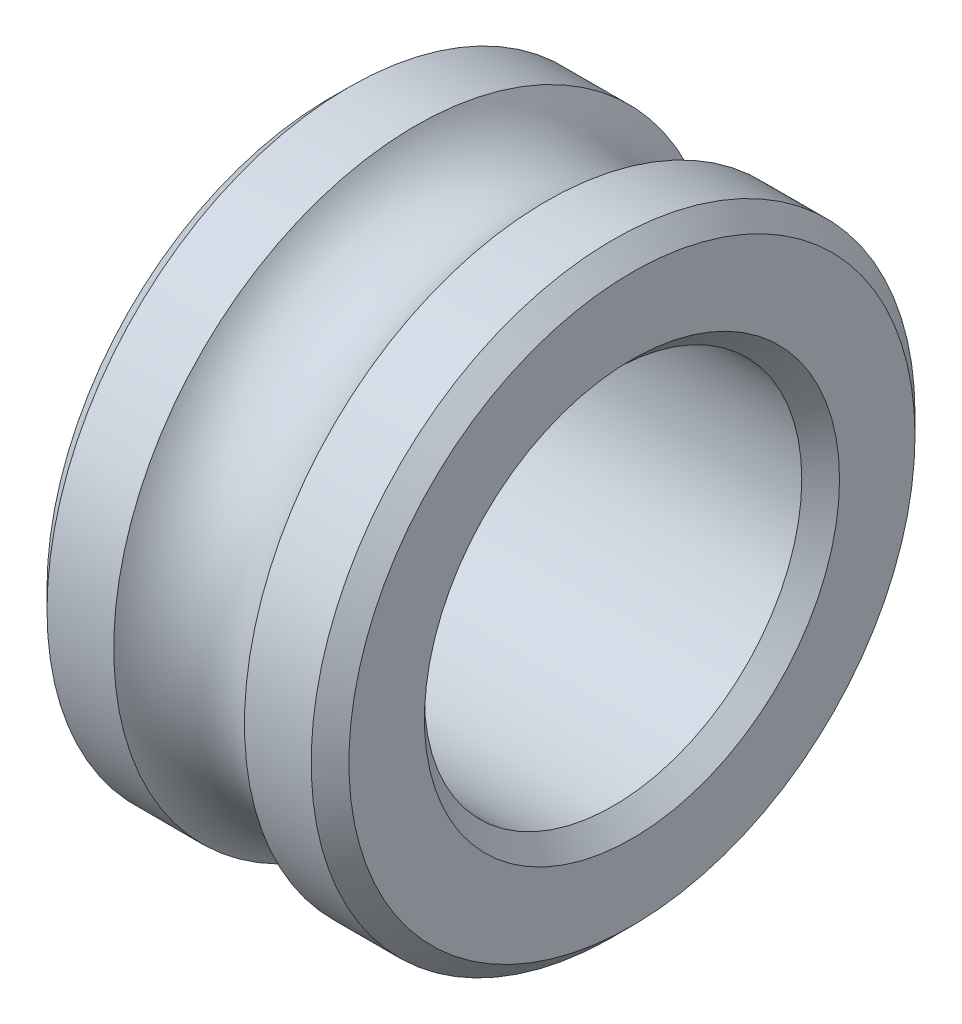
ISO-10303-21;
HEADER;
FILE_DESCRIPTION(('STEP AP214'),'2;1');
FILE_NAME('part.step','',(''),(''),'','','');
FILE_SCHEMA(('AUTOMOTIVE_DESIGN { 1 0 10303 214 1 1 1 1 }'));
ENDSEC;
DATA;
#1=APPLICATION_CONTEXT('core data for automotive mechanical design processes');
#2=APPLICATION_PROTOCOL_DEFINITION('international standard','automotive_design',2000,#1);
#3=PRODUCT_CONTEXT('',#1,'mechanical');
#4=PRODUCT('Part','Part','',(#3));
#5=PRODUCT_RELATED_PRODUCT_CATEGORY('part','',(#4));
#6=PRODUCT_DEFINITION_FORMATION('','',#4);
#7=PRODUCT_DEFINITION_CONTEXT('part definition',#1,'design');
#8=PRODUCT_DEFINITION('design','',#6,#7);
#9=PRODUCT_DEFINITION_SHAPE('','',#8);
#10=(LENGTH_UNIT() NAMED_UNIT(*) SI_UNIT(.MILLI.,.METRE.));
#11=(NAMED_UNIT(*) PLANE_ANGLE_UNIT() SI_UNIT($,.RADIAN.));
#12=(NAMED_UNIT(*) SI_UNIT($,.STERADIAN.) SOLID_ANGLE_UNIT());
#13=UNCERTAINTY_MEASURE_WITH_UNIT(LENGTH_MEASURE(1.E-05),#10,'distance_accuracy_value','');
#14=(GEOMETRIC_REPRESENTATION_CONTEXT(3) GLOBAL_UNCERTAINTY_ASSIGNED_CONTEXT((#13)) GLOBAL_UNIT_ASSIGNED_CONTEXT((#10,
#11,#12)) REPRESENTATION_CONTEXT('',''));
#15=CARTESIAN_POINT('',(0.,0.,0.));
#16=DIRECTION('',(0.,0.,1.));
#17=DIRECTION('',(1.,0.,0.));
#18=AXIS2_PLACEMENT_3D('',#15,#16,#17);
#19=CARTESIAN_POINT('',(-0.523961525529598,8.,0.));
#20=DIRECTION('',(1.,0.,0.));
#21=DIRECTION('',(0.,0.,-1.));
#22=AXIS2_PLACEMENT_3D('',#19,#20,#21);
#23=PLANE('',#22);
#24=CARTESIAN_POINT('',(-0.523961525529598,0.,0.));
#25=DIRECTION('',(1.,0.,0.));
#26=DIRECTION('',(0.,0.,-1.));
#27=AXIS2_PLACEMENT_3D('',#24,#25,#26);
#28=CIRCLE('',#27,7.5);
#29=CARTESIAN_POINT('',(-0.523961525529598,0.,-7.5));
#30=VERTEX_POINT('',#29);
#31=EDGE_CURVE('E58',#30,#30,#28,.T.);
#32=ORIENTED_EDGE('',*,*,#31,.T.);
#33=EDGE_LOOP('',(#32));
#34=FACE_BOUND('',#33,.T.);
#35=CARTESIAN_POINT('',(-0.523961525529598,0.,0.));
#36=DIRECTION('',(1.,0.,0.));
#37=DIRECTION('',(0.,0.,-1.));
#38=AXIS2_PLACEMENT_3D('',#35,#36,#37);
#39=CIRCLE('',#38,5.50000000000001);
#40=CARTESIAN_POINT('',(-0.523961525529598,0.,-5.50000000000001));
#41=VERTEX_POINT('',#40);
#42=EDGE_CURVE('E64',#41,#41,#39,.F.);
#43=ORIENTED_EDGE('',*,*,#42,.T.);
#44=EDGE_LOOP('',(#43));
#45=FACE_BOUND('',#44,.T.);
#46=ADVANCED_FACE('F39',(#34,#45),#23,.T.);
#47=CARTESIAN_POINT('',(0.,0.,0.));
#48=DIRECTION('',(1.,0.,0.));
#49=DIRECTION('',(0.,0.,-1.));
#50=AXIS2_PLACEMENT_3D('',#47,#48,#49);
#51=CYLINDRICAL_SURFACE('',#50,8.);
#52=CARTESIAN_POINT('',(-1.02396152552961,0.,0.));
#53=DIRECTION('',(1.,0.,0.));
#54=DIRECTION('',(0.,0.,-1.));
#55=AXIS2_PLACEMENT_3D('',#52,#53,#54);
#56=CIRCLE('',#55,8.);
#57=CARTESIAN_POINT('',(-1.02396152552961,0.,-8.));
#58=VERTEX_POINT('',#57);
#59=EDGE_CURVE('E53',#58,#58,#56,.F.);
#60=ORIENTED_EDGE('',*,*,#59,.T.);
#61=EDGE_LOOP('',(#60));
#62=FACE_BOUND('',#61,.T.);
#63=CARTESIAN_POINT('',(-2.79191071796072,0.,0.));
#64=DIRECTION('',(1.,0.,0.));
#65=DIRECTION('',(0.,0.,-1.));
#66=AXIS2_PLACEMENT_3D('',#63,#64,#65);
#67=CIRCLE('',#66,8.);
#68=CARTESIAN_POINT('',(-2.79191071796072,0.,-8.));
#69=VERTEX_POINT('',#68);
#70=EDGE_CURVE('E80',#69,#69,#67,.T.);
#71=ORIENTED_EDGE('',*,*,#70,.T.);
#72=EDGE_LOOP('',(#71));
#73=FACE_BOUND('',#72,.T.);
#74=ADVANCED_FACE('F104',(#62,#73),#51,.T.);
#75=CARTESIAN_POINT('',(-4.5239615255296,0.,0.));
#76=DIRECTION('',(1.,0.,0.));
#77=DIRECTION('',(0.,0.,-1.));
#78=AXIS2_PLACEMENT_3D('',#75,#76,#77);
#79=TOROIDAL_SURFACE('',#78,9.,2.);
#80=CARTESIAN_POINT('',(-6.25601233309848,0.,0.));
#81=DIRECTION('',(1.,0.,0.));
#82=DIRECTION('',(0.,0.,-1.));
#83=AXIS2_PLACEMENT_3D('',#80,#81,#82);
#84=CIRCLE('',#83,8.);
#85=CARTESIAN_POINT('',(-6.25601233309848,0.,-8.));
#86=VERTEX_POINT('',#85);
#87=EDGE_CURVE('E84',#86,#86,#84,.T.);
#88=ORIENTED_EDGE('',*,*,#87,.T.);
#89=EDGE_LOOP('',(#88));
#90=FACE_BOUND('',#89,.T.);
#91=ORIENTED_EDGE('',*,*,#70,.F.);
#92=EDGE_LOOP('',(#91));
#93=FACE_BOUND('',#92,.T.);
#94=ADVANCED_FACE('F89',(#90,#93),#79,.F.);
#95=CARTESIAN_POINT('',(0.,0.,0.));
#96=DIRECTION('',(1.,0.,0.));
#97=DIRECTION('',(0.,0.,-1.));
#98=AXIS2_PLACEMENT_3D('',#95,#96,#97);
#99=CYLINDRICAL_SURFACE('',#98,8.);
#100=CARTESIAN_POINT('',(-8.02396152552959,0.,0.));
#101=DIRECTION('',(-1.,0.,0.));
#102=DIRECTION('',(0.,0.,1.));
#103=AXIS2_PLACEMENT_3D('',#100,#101,#102);
#104=CIRCLE('',#103,8.);
#105=CARTESIAN_POINT('',(-8.02396152552959,0.,8.));
#106=VERTEX_POINT('',#105);
#107=EDGE_CURVE('E76',#106,#106,#104,.F.);
#108=ORIENTED_EDGE('',*,*,#107,.T.);
#109=EDGE_LOOP('',(#108));
#110=FACE_BOUND('',#109,.T.);
#111=ORIENTED_EDGE('',*,*,#87,.F.);
#112=EDGE_LOOP('',(#111));
#113=FACE_BOUND('',#112,.T.);
#114=ADVANCED_FACE('F92',(#110,#113),#99,.T.);
#115=CARTESIAN_POINT('',(-8.5239615255296,5.,0.));
#116=DIRECTION('',(-1.,0.,0.));
#117=DIRECTION('',(0.,0.,1.));
#118=AXIS2_PLACEMENT_3D('',#115,#116,#117);
#119=PLANE('',#118);
#120=CARTESIAN_POINT('',(-8.5239615255296,0.,0.));
#121=DIRECTION('',(-1.,0.,0.));
#122=DIRECTION('',(0.,0.,1.));
#123=AXIS2_PLACEMENT_3D('',#120,#121,#122);
#124=CIRCLE('',#123,7.49999999999999);
#125=CARTESIAN_POINT('',(-8.5239615255296,0.,7.49999999999999));
#126=VERTEX_POINT('',#125);
#127=EDGE_CURVE('E68',#126,#126,#124,.T.);
#128=ORIENTED_EDGE('',*,*,#127,.T.);
#129=EDGE_LOOP('',(#128));
#130=FACE_BOUND('',#129,.T.);
#131=CARTESIAN_POINT('',(-8.5239615255296,0.,0.));
#132=DIRECTION('',(-1.,0.,0.));
#133=DIRECTION('',(0.,0.,1.));
#134=AXIS2_PLACEMENT_3D('',#131,#132,#133);
#135=CIRCLE('',#134,5.5);
#136=CARTESIAN_POINT('',(-8.5239615255296,0.,5.5));
#137=VERTEX_POINT('',#136);
#138=EDGE_CURVE('E72',#137,#137,#135,.F.);
#139=ORIENTED_EDGE('',*,*,#138,.T.);
#140=EDGE_LOOP('',(#139));
#141=FACE_BOUND('',#140,.T.);
#142=ADVANCED_FACE('F94',(#130,#141),#119,.T.);
#143=CARTESIAN_POINT('',(0.,0.,0.));
#144=DIRECTION('',(1.,0.,0.));
#145=DIRECTION('',(0.,0.,-1.));
#146=AXIS2_PLACEMENT_3D('',#143,#144,#145);
#147=CYLINDRICAL_SURFACE('',#146,5.);
#148=CARTESIAN_POINT('',(-8.02396152552959,0.,0.));
#149=DIRECTION('',(-1.,0.,0.));
#150=DIRECTION('',(0.,0.,1.));
#151=AXIS2_PLACEMENT_3D('',#148,#149,#150);
#152=CIRCLE('',#151,5.);
#153=CARTESIAN_POINT('',(-8.02396152552959,0.,5.));
#154=VERTEX_POINT('',#153);
#155=EDGE_CURVE('E10',#154,#154,#152,.T.);
#156=ORIENTED_EDGE('',*,*,#155,.T.);
#157=EDGE_LOOP('',(#156));
#158=FACE_BOUND('',#157,.T.);
#159=CARTESIAN_POINT('',(-1.0239615255296,0.,0.));
#160=DIRECTION('',(1.,0.,0.));
#161=DIRECTION('',(0.,0.,-1.));
#162=AXIS2_PLACEMENT_3D('',#159,#160,#161);
#163=CIRCLE('',#162,5.);
#164=CARTESIAN_POINT('',(-1.0239615255296,0.,-5.));
#165=VERTEX_POINT('',#164);
#166=EDGE_CURVE('E48',#165,#165,#163,.T.);
#167=ORIENTED_EDGE('',*,*,#166,.T.);
#168=EDGE_LOOP('',(#167));
#169=FACE_BOUND('',#168,.T.);
#170=ADVANCED_FACE('F101',(#158,#169),#147,.F.);
#171=CARTESIAN_POINT('',(-8.02396152552959,0.,0.));
#172=DIRECTION('',(1.,0.,0.));
#173=DIRECTION('',(0.,0.,-1.));
#174=AXIS2_PLACEMENT_3D('',#171,#172,#173);
#175=CONICAL_SURFACE('',#174,8.,0.785398163397453);
#176=ORIENTED_EDGE('',*,*,#127,.F.);
#177=EDGE_LOOP('',(#176));
#178=FACE_BOUND('',#177,.T.);
#179=ORIENTED_EDGE('',*,*,#107,.F.);
#180=EDGE_LOOP('',(#179));
#181=FACE_BOUND('',#180,.T.);
#182=ADVANCED_FACE('F117',(#178,#181),#175,.T.);
#183=CARTESIAN_POINT('',(-0.523961525529598,0.,0.));
#184=DIRECTION('',(-1.,0.,0.));
#185=DIRECTION('',(0.,0.,1.));
#186=AXIS2_PLACEMENT_3D('',#183,#184,#185);
#187=CONICAL_SURFACE('',#186,7.5,0.785398163397444);
#188=ORIENTED_EDGE('',*,*,#59,.F.);
#189=EDGE_LOOP('',(#188));
#190=FACE_BOUND('',#189,.T.);
#191=ORIENTED_EDGE('',*,*,#31,.F.);
#192=EDGE_LOOP('',(#191));
#193=FACE_BOUND('',#192,.T.);
#194=ADVANCED_FACE('F123',(#190,#193),#187,.T.);
#195=CARTESIAN_POINT('',(-8.5239615255296,0.,0.));
#196=DIRECTION('',(-1.,0.,0.));
#197=DIRECTION('',(0.,0.,1.));
#198=AXIS2_PLACEMENT_3D('',#195,#196,#197);
#199=CONICAL_SURFACE('',#198,5.5,0.785398163397443);
#200=ORIENTED_EDGE('',*,*,#155,.F.);
#201=EDGE_LOOP('',(#200));
#202=FACE_BOUND('',#201,.T.);
#203=ORIENTED_EDGE('',*,*,#138,.F.);
#204=EDGE_LOOP('',(#203));
#205=FACE_BOUND('',#204,.T.);
#206=ADVANCED_FACE('F129',(#202,#205),#199,.F.);
#207=CARTESIAN_POINT('',(-1.0239615255296,0.,0.));
#208=DIRECTION('',(1.,0.,0.));
#209=DIRECTION('',(0.,0.,-1.));
#210=AXIS2_PLACEMENT_3D('',#207,#208,#209);
#211=CONICAL_SURFACE('',#210,5.,0.785398163397454);
#212=ORIENTED_EDGE('',*,*,#42,.F.);
#213=EDGE_LOOP('',(#212));
#214=FACE_BOUND('',#213,.T.);
#215=ORIENTED_EDGE('',*,*,#166,.F.);
#216=EDGE_LOOP('',(#215));
#217=FACE_BOUND('',#216,.T.);
#218=ADVANCED_FACE('F42',(#214,#217),#211,.F.);
#219=CLOSED_SHELL('',(#46,#74,#94,#114,#142,#170,#182,#194,#206,#218));
#220=MANIFOLD_SOLID_BREP('B2',#219);
#221=ADVANCED_BREP_SHAPE_REPRESENTATION('',(#18,#220),#14);
#222=SHAPE_DEFINITION_REPRESENTATION(#9,#221);
ENDSEC;
END-ISO-10303-21;
